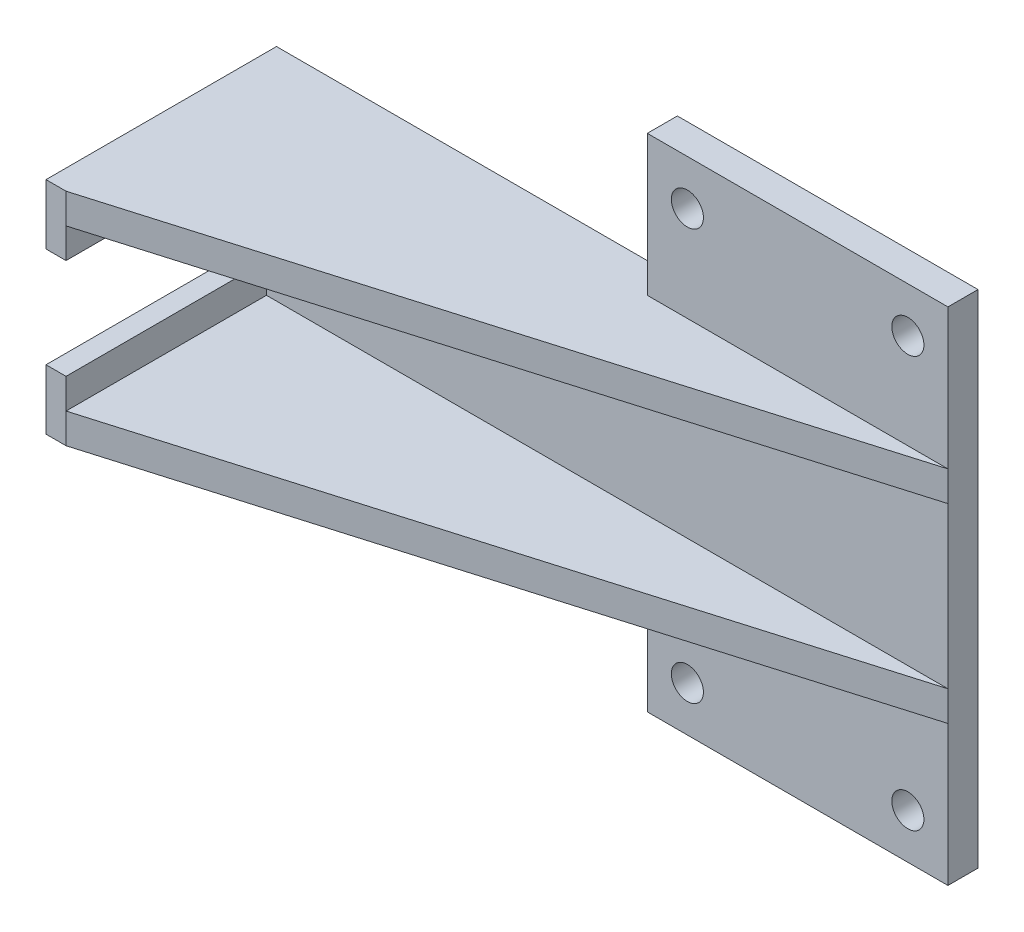
ISO-10303-21;
HEADER;
FILE_DESCRIPTION(('STEP AP214'),'2;1');
FILE_NAME('part.step','',(''),(''),'','','');
FILE_SCHEMA(('AUTOMOTIVE_DESIGN { 1 0 10303 214 1 1 1 1 }'));
ENDSEC;
DATA;
#1=APPLICATION_CONTEXT('core data for automotive mechanical design processes');
#2=APPLICATION_PROTOCOL_DEFINITION('international standard','automotive_design',2000,#1);
#3=PRODUCT_CONTEXT('',#1,'mechanical');
#4=PRODUCT('Part','Part','',(#3));
#5=PRODUCT_RELATED_PRODUCT_CATEGORY('part','',(#4));
#6=PRODUCT_DEFINITION_FORMATION('','',#4);
#7=PRODUCT_DEFINITION_CONTEXT('part definition',#1,'design');
#8=PRODUCT_DEFINITION('design','',#6,#7);
#9=PRODUCT_DEFINITION_SHAPE('','',#8);
#10=(LENGTH_UNIT() NAMED_UNIT(*) SI_UNIT(.MILLI.,.METRE.));
#11=(NAMED_UNIT(*) PLANE_ANGLE_UNIT() SI_UNIT($,.RADIAN.));
#12=(NAMED_UNIT(*) SI_UNIT($,.STERADIAN.) SOLID_ANGLE_UNIT());
#13=UNCERTAINTY_MEASURE_WITH_UNIT(LENGTH_MEASURE(1.E-05),#10,'distance_accuracy_value','');
#14=(GEOMETRIC_REPRESENTATION_CONTEXT(3) GLOBAL_UNCERTAINTY_ASSIGNED_CONTEXT((#13)) GLOBAL_UNIT_ASSIGNED_CONTEXT((#10,
#11,#12)) REPRESENTATION_CONTEXT('',''));
#15=CARTESIAN_POINT('',(0.,0.,0.));
#16=DIRECTION('',(0.,0.,1.));
#17=DIRECTION('',(1.,0.,0.));
#18=AXIS2_PLACEMENT_3D('',#15,#16,#17);
#19=CARTESIAN_POINT('',(0.,0.,3.));
#20=DIRECTION('',(0.,0.,-1.));
#21=DIRECTION('',(-1.,0.,0.));
#22=AXIS2_PLACEMENT_3D('',#19,#20,#21);
#23=PLANE('',#22);
#24=CARTESIAN_POINT('',(-14.,-35.5,3.));
#25=DIRECTION('',(0.,0.,1.));
#26=DIRECTION('',(1.,0.,0.));
#27=AXIS2_PLACEMENT_3D('',#24,#25,#26);
#28=CIRCLE('',#27,1.60000000000001);
#29=CARTESIAN_POINT('',(-12.4,-35.5,3.));
#30=VERTEX_POINT('',#29);
#31=EDGE_CURVE('E275',#30,#30,#28,.T.);
#32=ORIENTED_EDGE('',*,*,#31,.F.);
#33=EDGE_LOOP('',(#32));
#34=FACE_BOUND('',#33,.T.);
#35=CARTESIAN_POINT('',(-36.,-35.5,3.));
#36=DIRECTION('',(0.,0.,1.));
#37=DIRECTION('',(1.,0.,0.));
#38=AXIS2_PLACEMENT_3D('',#35,#36,#37);
#39=CIRCLE('',#38,1.60000000000002);
#40=CARTESIAN_POINT('',(-34.4,-35.5,3.));
#41=VERTEX_POINT('',#40);
#42=EDGE_CURVE('E263',#41,#41,#39,.T.);
#43=ORIENTED_EDGE('',*,*,#42,.F.);
#44=EDGE_LOOP('',(#43));
#45=FACE_BOUND('',#44,.T.);
#46=DIRECTION('',(-1.,0.,0.));
#47=VECTOR('',#46,1.);
#48=CARTESIAN_POINT('',(-40.,-26.,3.));
#49=LINE('',#48,#47);
#50=CARTESIAN_POINT('',(-10.,-26.,3.));
#51=VERTEX_POINT('',#50);
#52=CARTESIAN_POINT('',(-40.,-26.,3.));
#53=VERTEX_POINT('',#52);
#54=EDGE_CURVE('E188',#51,#53,#49,.T.);
#55=ORIENTED_EDGE('',*,*,#54,.T.);
#56=DIRECTION('',(0.,-1.,0.));
#57=VECTOR('',#56,1.);
#58=CARTESIAN_POINT('',(-40.,-23.,3.));
#59=LINE('',#58,#57);
#60=CARTESIAN_POINT('',(-40.,-40.,3.));
#61=VERTEX_POINT('',#60);
#62=EDGE_CURVE('E296',#53,#61,#59,.T.);
#63=ORIENTED_EDGE('',*,*,#62,.T.);
#64=DIRECTION('',(1.,0.,0.));
#65=VECTOR('',#64,1.);
#66=CARTESIAN_POINT('',(-10.,-40.,3.));
#67=LINE('',#66,#65);
#68=CARTESIAN_POINT('',(-10.,-40.,3.));
#69=VERTEX_POINT('',#68);
#70=EDGE_CURVE('E298',#61,#69,#67,.T.);
#71=ORIENTED_EDGE('',*,*,#70,.T.);
#72=DIRECTION('',(0.,1.,0.));
#73=VECTOR('',#72,1.);
#74=CARTESIAN_POINT('',(-10.,10.,3.));
#75=LINE('',#74,#73);
#76=EDGE_CURVE('E281',#69,#51,#75,.T.);
#77=ORIENTED_EDGE('',*,*,#76,.T.);
#78=EDGE_LOOP('',(#55,#63,#71,#77));
#79=FACE_BOUND('',#78,.T.);
#80=ADVANCED_FACE('F35',(#34,#45,#79),#23,.F.);
#81=CARTESIAN_POINT('',(-40.,-23.,3.));
#82=DIRECTION('',(1.,0.,0.));
#83=DIRECTION('',(0.,0.,-1.));
#84=AXIS2_PLACEMENT_3D('',#81,#82,#83);
#85=PLANE('',#84);
#86=DIRECTION('',(0.,0.,-1.));
#87=VECTOR('',#86,1.);
#88=CARTESIAN_POINT('',(-40.,-26.,0.));
#89=LINE('',#88,#87);
#90=CARTESIAN_POINT('',(-40.,-26.,0.));
#91=VERTEX_POINT('',#90);
#92=EDGE_CURVE('E183',#53,#91,#89,.T.);
#93=ORIENTED_EDGE('',*,*,#92,.T.);
#94=DIRECTION('',(0.,-1.,0.));
#95=VECTOR('',#94,1.);
#96=CARTESIAN_POINT('',(-40.,-23.,0.));
#97=LINE('',#96,#95);
#98=CARTESIAN_POINT('',(-40.,-40.,0.));
#99=VERTEX_POINT('',#98);
#100=EDGE_CURVE('E309',#91,#99,#97,.T.);
#101=ORIENTED_EDGE('',*,*,#100,.T.);
#102=DIRECTION('',(0.,0.,-1.));
#103=VECTOR('',#102,1.);
#104=CARTESIAN_POINT('',(-40.,-40.,3.));
#105=LINE('',#104,#103);
#106=EDGE_CURVE('E315',#61,#99,#105,.T.);
#107=ORIENTED_EDGE('',*,*,#106,.F.);
#108=ORIENTED_EDGE('',*,*,#62,.F.);
#109=EDGE_LOOP('',(#93,#101,#107,#108));
#110=FACE_BOUND('',#109,.T.);
#111=ADVANCED_FACE('F371',(#110),#85,.F.);
#112=CARTESIAN_POINT('',(-36.,5.5,3.));
#113=DIRECTION('',(0.,0.,1.));
#114=DIRECTION('',(1.,0.,0.));
#115=AXIS2_PLACEMENT_3D('',#112,#113,#114);
#116=CIRCLE('',#115,1.60000000000002);
#117=CARTESIAN_POINT('',(-34.4,5.5,3.));
#118=VERTEX_POINT('',#117);
#119=EDGE_CURVE('E269',#118,#118,#116,.T.);
#120=ORIENTED_EDGE('',*,*,#119,.F.);
#121=EDGE_LOOP('',(#120));
#122=FACE_BOUND('',#121,.T.);
#123=CARTESIAN_POINT('',(-14.,5.5,3.));
#124=DIRECTION('',(0.,0.,1.));
#125=DIRECTION('',(1.,0.,0.));
#126=AXIS2_PLACEMENT_3D('',#123,#124,#125);
#127=CIRCLE('',#126,1.60000000000001);
#128=CARTESIAN_POINT('',(-12.4,5.5,3.));
#129=VERTEX_POINT('',#128);
#130=EDGE_CURVE('E257',#129,#129,#127,.T.);
#131=ORIENTED_EDGE('',*,*,#130,.F.);
#132=EDGE_LOOP('',(#131));
#133=FACE_BOUND('',#132,.T.);
#134=DIRECTION('',(-1.,0.,0.));
#135=VECTOR('',#134,1.);
#136=CARTESIAN_POINT('',(-40.,-4.,3.));
#137=LINE('',#136,#135);
#138=CARTESIAN_POINT('',(-10.,-4.,3.));
#139=VERTEX_POINT('',#138);
#140=CARTESIAN_POINT('',(-40.,-4.,3.));
#141=VERTEX_POINT('',#140);
#142=EDGE_CURVE('E205',#139,#141,#137,.T.);
#143=ORIENTED_EDGE('',*,*,#142,.F.);
#144=CARTESIAN_POINT('',(-10.,10.,3.));
#145=VERTEX_POINT('',#144);
#146=EDGE_CURVE('E286',#139,#145,#75,.T.);
#147=ORIENTED_EDGE('',*,*,#146,.T.);
#148=DIRECTION('',(-1.,0.,0.));
#149=VECTOR('',#148,1.);
#150=CARTESIAN_POINT('',(-10.,10.,3.));
#151=LINE('',#150,#149);
#152=CARTESIAN_POINT('',(-40.,10.,3.));
#153=VERTEX_POINT('',#152);
#154=EDGE_CURVE('E284',#145,#153,#151,.T.);
#155=ORIENTED_EDGE('',*,*,#154,.T.);
#156=DIRECTION('',(0.,-1.,0.));
#157=VECTOR('',#156,1.);
#158=CARTESIAN_POINT('',(-40.,10.,3.));
#159=LINE('',#158,#157);
#160=EDGE_CURVE('E288',#153,#141,#159,.T.);
#161=ORIENTED_EDGE('',*,*,#160,.T.);
#162=EDGE_LOOP('',(#143,#147,#155,#161));
#163=FACE_BOUND('',#162,.T.);
#164=ADVANCED_FACE('F347',(#122,#133,#163),#23,.F.);
#165=CARTESIAN_POINT('',(-40.,10.,3.));
#166=DIRECTION('',(1.,0.,0.));
#167=DIRECTION('',(0.,0.,-1.));
#168=AXIS2_PLACEMENT_3D('',#165,#166,#167);
#169=PLANE('',#168);
#170=DIRECTION('',(0.,0.,-1.));
#171=VECTOR('',#170,1.);
#172=CARTESIAN_POINT('',(-40.,-4.,0.));
#173=LINE('',#172,#171);
#174=CARTESIAN_POINT('',(-40.,-4.,0.));
#175=VERTEX_POINT('',#174);
#176=EDGE_CURVE('E207',#141,#175,#173,.T.);
#177=ORIENTED_EDGE('',*,*,#176,.F.);
#178=ORIENTED_EDGE('',*,*,#160,.F.);
#179=DIRECTION('',(0.,0.,-1.));
#180=VECTOR('',#179,1.);
#181=CARTESIAN_POINT('',(-40.,10.,3.));
#182=LINE('',#181,#180);
#183=CARTESIAN_POINT('',(-40.,10.,0.));
#184=VERTEX_POINT('',#183);
#185=EDGE_CURVE('E43',#153,#184,#182,.T.);
#186=ORIENTED_EDGE('',*,*,#185,.T.);
#187=DIRECTION('',(0.,-1.,0.));
#188=VECTOR('',#187,1.);
#189=CARTESIAN_POINT('',(-40.,10.,0.));
#190=LINE('',#189,#188);
#191=EDGE_CURVE('E305',#184,#175,#190,.T.);
#192=ORIENTED_EDGE('',*,*,#191,.T.);
#193=EDGE_LOOP('',(#177,#178,#186,#192));
#194=FACE_BOUND('',#193,.T.);
#195=ADVANCED_FACE('F323',(#194),#169,.F.);
#196=DIRECTION('',(1.,0.,0.));
#197=VECTOR('',#196,1.);
#198=CARTESIAN_POINT('',(-80.,-23.,3.));
#199=LINE('',#198,#197);
#200=CARTESIAN_POINT('',(-78.,-23.,3.));
#201=VERTEX_POINT('',#200);
#202=CARTESIAN_POINT('',(-10.,-23.,3.));
#203=VERTEX_POINT('',#202);
#204=EDGE_CURVE('E294',#201,#203,#199,.T.);
#205=ORIENTED_EDGE('',*,*,#204,.T.);
#206=CARTESIAN_POINT('',(-10.,-7.,3.));
#207=VERTEX_POINT('',#206);
#208=EDGE_CURVE('E285',#203,#207,#75,.T.);
#209=ORIENTED_EDGE('',*,*,#208,.T.);
#210=DIRECTION('',(-1.,0.,0.));
#211=VECTOR('',#210,1.);
#212=CARTESIAN_POINT('',(-80.,-7.,3.));
#213=LINE('',#212,#211);
#214=CARTESIAN_POINT('',(-78.,-7.,3.));
#215=VERTEX_POINT('',#214);
#216=EDGE_CURVE('E291',#207,#215,#213,.T.);
#217=ORIENTED_EDGE('',*,*,#216,.T.);
#218=DIRECTION('',(0.,1.,0.));
#219=VECTOR('',#218,1.);
#220=CARTESIAN_POINT('',(-78.,-7.,3.));
#221=LINE('',#220,#219);
#222=CARTESIAN_POINT('',(-78.,-10.,3.));
#223=VERTEX_POINT('',#222);
#224=EDGE_CURVE('E50',#223,#215,#221,.T.);
#225=ORIENTED_EDGE('',*,*,#224,.F.);
#226=DIRECTION('',(1.,0.,0.));
#227=VECTOR('',#226,1.);
#228=CARTESIAN_POINT('',(-80.,-10.,3.));
#229=LINE('',#228,#227);
#230=CARTESIAN_POINT('',(-80.,-10.,3.));
#231=VERTEX_POINT('',#230);
#232=EDGE_CURVE('E223',#231,#223,#229,.T.);
#233=ORIENTED_EDGE('',*,*,#232,.F.);
#234=DIRECTION('',(0.,-1.,0.));
#235=VECTOR('',#234,1.);
#236=CARTESIAN_POINT('',(-80.,-23.,3.));
#237=LINE('',#236,#235);
#238=CARTESIAN_POINT('',(-80.,-20.,3.));
#239=VERTEX_POINT('',#238);
#240=EDGE_CURVE('E56',#231,#239,#237,.T.);
#241=ORIENTED_EDGE('',*,*,#240,.T.);
#242=DIRECTION('',(-1.,0.,0.));
#243=VECTOR('',#242,1.);
#244=CARTESIAN_POINT('',(-80.,-20.,3.));
#245=LINE('',#244,#243);
#246=CARTESIAN_POINT('',(-78.,-20.,3.));
#247=VERTEX_POINT('',#246);
#248=EDGE_CURVE('E167',#247,#239,#245,.T.);
#249=ORIENTED_EDGE('',*,*,#248,.F.);
#250=DIRECTION('',(0.,1.,0.));
#251=VECTOR('',#250,1.);
#252=CARTESIAN_POINT('',(-78.,-23.,3.));
#253=LINE('',#252,#251);
#254=EDGE_CURVE('E241',#201,#247,#253,.T.);
#255=ORIENTED_EDGE('',*,*,#254,.F.);
#256=EDGE_LOOP('',(#205,#209,#217,#225,#233,#241,#249,#255));
#257=FACE_BOUND('',#256,.T.);
#258=ADVANCED_FACE('F350',(#257),#23,.F.);
#259=CARTESIAN_POINT('',(0.,0.,0.));
#260=DIRECTION('',(0.,0.,-1.));
#261=DIRECTION('',(-1.,0.,0.));
#262=AXIS2_PLACEMENT_3D('',#259,#260,#261);
#263=PLANE('',#262);
#264=CARTESIAN_POINT('',(-36.,-35.5,0.));
#265=DIRECTION('',(0.,0.,1.));
#266=DIRECTION('',(1.,0.,0.));
#267=AXIS2_PLACEMENT_3D('',#264,#265,#266);
#268=CIRCLE('',#267,1.60000000000002);
#269=CARTESIAN_POINT('',(-34.4,-35.5,0.));
#270=VERTEX_POINT('',#269);
#271=EDGE_CURVE('E260',#270,#270,#268,.T.);
#272=ORIENTED_EDGE('',*,*,#271,.T.);
#273=EDGE_LOOP('',(#272));
#274=FACE_BOUND('',#273,.T.);
#275=CARTESIAN_POINT('',(-14.,-35.5,0.));
#276=DIRECTION('',(0.,0.,1.));
#277=DIRECTION('',(1.,0.,0.));
#278=AXIS2_PLACEMENT_3D('',#275,#276,#277);
#279=CIRCLE('',#278,1.60000000000001);
#280=CARTESIAN_POINT('',(-12.4,-35.5,0.));
#281=VERTEX_POINT('',#280);
#282=EDGE_CURVE('E272',#281,#281,#279,.T.);
#283=ORIENTED_EDGE('',*,*,#282,.T.);
#284=EDGE_LOOP('',(#283));
#285=FACE_BOUND('',#284,.T.);
#286=DIRECTION('',(0.,1.,0.));
#287=VECTOR('',#286,1.);
#288=CARTESIAN_POINT('',(-10.,10.,0.));
#289=LINE('',#288,#287);
#290=CARTESIAN_POINT('',(-10.,-40.,0.));
#291=VERTEX_POINT('',#290);
#292=CARTESIAN_POINT('',(-10.,10.,0.));
#293=VERTEX_POINT('',#292);
#294=EDGE_CURVE('E278',#291,#293,#289,.T.);
#295=ORIENTED_EDGE('',*,*,#294,.F.);
#296=DIRECTION('',(1.,0.,0.));
#297=VECTOR('',#296,1.);
#298=CARTESIAN_POINT('',(-10.,-40.,0.));
#299=LINE('',#298,#297);
#300=EDGE_CURVE('E311',#99,#291,#299,.T.);
#301=ORIENTED_EDGE('',*,*,#300,.F.);
#302=ORIENTED_EDGE('',*,*,#100,.F.);
#303=DIRECTION('',(-1.,0.,0.));
#304=VECTOR('',#303,1.);
#305=CARTESIAN_POINT('',(-80.,-26.,0.));
#306=LINE('',#305,#304);
#307=CARTESIAN_POINT('',(-80.,-26.,0.));
#308=VERTEX_POINT('',#307);
#309=EDGE_CURVE('E181',#91,#308,#306,.T.);
#310=ORIENTED_EDGE('',*,*,#309,.T.);
#311=DIRECTION('',(0.,-1.,0.));
#312=VECTOR('',#311,1.);
#313=CARTESIAN_POINT('',(-80.,-23.,0.));
#314=LINE('',#313,#312);
#315=CARTESIAN_POINT('',(-80.,-4.,0.));
#316=VERTEX_POINT('',#315);
#317=EDGE_CURVE('E180',#316,#308,#314,.T.);
#318=ORIENTED_EDGE('',*,*,#317,.F.);
#319=DIRECTION('',(-1.,0.,0.));
#320=VECTOR('',#319,1.);
#321=CARTESIAN_POINT('',(-80.,-4.,0.));
#322=LINE('',#321,#320);
#323=EDGE_CURVE('E209',#175,#316,#322,.T.);
#324=ORIENTED_EDGE('',*,*,#323,.F.);
#325=ORIENTED_EDGE('',*,*,#191,.F.);
#326=DIRECTION('',(-1.,0.,0.));
#327=VECTOR('',#326,1.);
#328=CARTESIAN_POINT('',(-10.,10.,0.));
#329=LINE('',#328,#327);
#330=EDGE_CURVE('E303',#293,#184,#329,.T.);
#331=ORIENTED_EDGE('',*,*,#330,.F.);
#332=EDGE_LOOP('',(#295,#301,#302,#310,#318,#324,#325,#331));
#333=FACE_BOUND('',#332,.T.);
#334=CARTESIAN_POINT('',(-36.,5.5,0.));
#335=DIRECTION('',(0.,0.,1.));
#336=DIRECTION('',(1.,0.,0.));
#337=AXIS2_PLACEMENT_3D('',#334,#335,#336);
#338=CIRCLE('',#337,1.60000000000002);
#339=CARTESIAN_POINT('',(-34.4,5.5,0.));
#340=VERTEX_POINT('',#339);
#341=EDGE_CURVE('E266',#340,#340,#338,.T.);
#342=ORIENTED_EDGE('',*,*,#341,.T.);
#343=EDGE_LOOP('',(#342));
#344=FACE_BOUND('',#343,.T.);
#345=CARTESIAN_POINT('',(-14.,5.5,0.));
#346=DIRECTION('',(0.,0.,1.));
#347=DIRECTION('',(1.,0.,0.));
#348=AXIS2_PLACEMENT_3D('',#345,#346,#347);
#349=CIRCLE('',#348,1.60000000000001);
#350=CARTESIAN_POINT('',(-12.4,5.5,0.));
#351=VERTEX_POINT('',#350);
#352=EDGE_CURVE('E256',#351,#351,#349,.T.);
#353=ORIENTED_EDGE('',*,*,#352,.T.);
#354=EDGE_LOOP('',(#353));
#355=FACE_BOUND('',#354,.T.);
#356=ADVANCED_FACE('F329',(#274,#285,#333,#344,#355),#263,.T.);
#357=CARTESIAN_POINT('',(-10.,10.,3.));
#358=DIRECTION('',(-1.,0.,0.));
#359=DIRECTION('',(0.,0.,1.));
#360=AXIS2_PLACEMENT_3D('',#357,#358,#359);
#361=PLANE('',#360);
#362=ORIENTED_EDGE('',*,*,#294,.T.);
#363=DIRECTION('',(0.,0.,-1.));
#364=VECTOR('',#363,1.);
#365=CARTESIAN_POINT('',(-10.,10.,3.));
#366=LINE('',#365,#364);
#367=EDGE_CURVE('E11',#145,#293,#366,.T.);
#368=ORIENTED_EDGE('',*,*,#367,.F.);
#369=ORIENTED_EDGE('',*,*,#146,.F.);
#370=DIRECTION('',(0.,-1.,0.));
#371=VECTOR('',#370,1.);
#372=CARTESIAN_POINT('',(-10.,-4.,3.));
#373=LINE('',#372,#371);
#374=EDGE_CURVE('E215',#139,#207,#373,.T.);
#375=ORIENTED_EDGE('',*,*,#374,.T.);
#376=ORIENTED_EDGE('',*,*,#208,.F.);
#377=DIRECTION('',(0.,1.,0.));
#378=VECTOR('',#377,1.);
#379=CARTESIAN_POINT('',(-10.,-26.,3.));
#380=LINE('',#379,#378);
#381=EDGE_CURVE('E196',#51,#203,#380,.T.);
#382=ORIENTED_EDGE('',*,*,#381,.F.);
#383=ORIENTED_EDGE('',*,*,#76,.F.);
#384=DIRECTION('',(0.,0.,-1.));
#385=VECTOR('',#384,1.);
#386=CARTESIAN_POINT('',(-10.,-40.,3.));
#387=LINE('',#386,#385);
#388=EDGE_CURVE('E300',#69,#291,#387,.T.);
#389=ORIENTED_EDGE('',*,*,#388,.T.);
#390=EDGE_LOOP('',(#362,#368,#369,#375,#376,#382,#383,#389));
#391=FACE_BOUND('',#390,.T.);
#392=ADVANCED_FACE('F37',(#391),#361,.F.);
#393=CARTESIAN_POINT('',(-10.,10.,3.));
#394=DIRECTION('',(0.,-1.,0.));
#395=DIRECTION('',(0.,0.,-1.));
#396=AXIS2_PLACEMENT_3D('',#393,#394,#395);
#397=PLANE('',#396);
#398=ORIENTED_EDGE('',*,*,#330,.T.);
#399=ORIENTED_EDGE('',*,*,#185,.F.);
#400=ORIENTED_EDGE('',*,*,#154,.F.);
#401=ORIENTED_EDGE('',*,*,#367,.T.);
#402=EDGE_LOOP('',(#398,#399,#400,#401));
#403=FACE_BOUND('',#402,.T.);
#404=ADVANCED_FACE('F395',(#403),#397,.F.);
#405=CARTESIAN_POINT('',(-80.,-23.,3.));
#406=DIRECTION('',(1.,0.,0.));
#407=DIRECTION('',(0.,0.,-1.));
#408=AXIS2_PLACEMENT_3D('',#405,#406,#407);
#409=PLANE('',#408);
#410=ORIENTED_EDGE('',*,*,#317,.T.);
#411=DIRECTION('',(0.,0.,1.));
#412=VECTOR('',#411,1.);
#413=CARTESIAN_POINT('',(-80.,-26.,23.));
#414=LINE('',#413,#412);
#415=CARTESIAN_POINT('',(-80.,-26.,23.));
#416=VERTEX_POINT('',#415);
#417=EDGE_CURVE('E172',#308,#416,#414,.T.);
#418=ORIENTED_EDGE('',*,*,#417,.T.);
#419=DIRECTION('',(0.,-1.,0.));
#420=VECTOR('',#419,1.);
#421=CARTESIAN_POINT('',(-80.,-23.,23.));
#422=LINE('',#421,#420);
#423=CARTESIAN_POINT('',(-80.,-20.,23.));
#424=VERTEX_POINT('',#423);
#425=EDGE_CURVE('E154',#424,#416,#422,.T.);
#426=ORIENTED_EDGE('',*,*,#425,.F.);
#427=DIRECTION('',(0.,0.,-1.));
#428=VECTOR('',#427,1.);
#429=CARTESIAN_POINT('',(-80.,-20.,23.));
#430=LINE('',#429,#428);
#431=EDGE_CURVE('E245',#424,#239,#430,.T.);
#432=ORIENTED_EDGE('',*,*,#431,.T.);
#433=ORIENTED_EDGE('',*,*,#240,.F.);
#434=DIRECTION('',(0.,0.,-1.));
#435=VECTOR('',#434,1.);
#436=CARTESIAN_POINT('',(-80.,-10.,23.));
#437=LINE('',#436,#435);
#438=CARTESIAN_POINT('',(-80.,-10.,23.));
#439=VERTEX_POINT('',#438);
#440=EDGE_CURVE('E239',#439,#231,#437,.T.);
#441=ORIENTED_EDGE('',*,*,#440,.F.);
#442=DIRECTION('',(0.,-1.,0.));
#443=VECTOR('',#442,1.);
#444=CARTESIAN_POINT('',(-80.,-7.,23.));
#445=LINE('',#444,#443);
#446=CARTESIAN_POINT('',(-80.,-4.,23.));
#447=VERTEX_POINT('',#446);
#448=EDGE_CURVE('E224',#447,#439,#445,.T.);
#449=ORIENTED_EDGE('',*,*,#448,.F.);
#450=DIRECTION('',(0.,0.,1.));
#451=VECTOR('',#450,1.);
#452=CARTESIAN_POINT('',(-80.,-4.,23.));
#453=LINE('',#452,#451);
#454=EDGE_CURVE('E212',#316,#447,#453,.T.);
#455=ORIENTED_EDGE('',*,*,#454,.F.);
#456=EDGE_LOOP('',(#410,#418,#426,#432,#433,#441,#449,#455));
#457=FACE_BOUND('',#456,.T.);
#458=ADVANCED_FACE('F178',(#457),#409,.F.);
#459=CARTESIAN_POINT('',(-10.,-40.,3.));
#460=DIRECTION('',(0.,1.,0.));
#461=DIRECTION('',(0.,0.,1.));
#462=AXIS2_PLACEMENT_3D('',#459,#460,#461);
#463=PLANE('',#462);
#464=ORIENTED_EDGE('',*,*,#300,.T.);
#465=ORIENTED_EDGE('',*,*,#388,.F.);
#466=ORIENTED_EDGE('',*,*,#70,.F.);
#467=ORIENTED_EDGE('',*,*,#106,.T.);
#468=EDGE_LOOP('',(#464,#465,#466,#467));
#469=FACE_BOUND('',#468,.T.);
#470=ADVANCED_FACE('F401',(#469),#463,.F.);
#471=CARTESIAN_POINT('',(-14.,-35.5,3.));
#472=DIRECTION('',(0.,0.,-1.));
#473=DIRECTION('',(-1.,0.,0.));
#474=AXIS2_PLACEMENT_3D('',#471,#472,#473);
#475=CYLINDRICAL_SURFACE('',#474,1.60000000000001);
#476=ORIENTED_EDGE('',*,*,#31,.T.);
#477=EDGE_LOOP('',(#476));
#478=FACE_BOUND('',#477,.T.);
#479=ORIENTED_EDGE('',*,*,#282,.F.);
#480=EDGE_LOOP('',(#479));
#481=FACE_BOUND('',#480,.T.);
#482=ADVANCED_FACE('F438',(#478,#481),#475,.F.);
#483=CARTESIAN_POINT('',(-36.,5.5,3.));
#484=DIRECTION('',(0.,0.,-1.));
#485=DIRECTION('',(-1.,0.,0.));
#486=AXIS2_PLACEMENT_3D('',#483,#484,#485);
#487=CYLINDRICAL_SURFACE('',#486,1.60000000000002);
#488=ORIENTED_EDGE('',*,*,#119,.T.);
#489=EDGE_LOOP('',(#488));
#490=FACE_BOUND('',#489,.T.);
#491=ORIENTED_EDGE('',*,*,#341,.F.);
#492=EDGE_LOOP('',(#491));
#493=FACE_BOUND('',#492,.T.);
#494=ADVANCED_FACE('F435',(#490,#493),#487,.F.);
#495=CARTESIAN_POINT('',(-36.,-35.5,3.));
#496=DIRECTION('',(0.,0.,-1.));
#497=DIRECTION('',(-1.,0.,0.));
#498=AXIS2_PLACEMENT_3D('',#495,#496,#497);
#499=CYLINDRICAL_SURFACE('',#498,1.60000000000002);
#500=ORIENTED_EDGE('',*,*,#42,.T.);
#501=EDGE_LOOP('',(#500));
#502=FACE_BOUND('',#501,.T.);
#503=ORIENTED_EDGE('',*,*,#271,.F.);
#504=EDGE_LOOP('',(#503));
#505=FACE_BOUND('',#504,.T.);
#506=ADVANCED_FACE('F431',(#502,#505),#499,.F.);
#507=CARTESIAN_POINT('',(-14.,5.5,3.));
#508=DIRECTION('',(0.,0.,-1.));
#509=DIRECTION('',(-1.,0.,0.));
#510=AXIS2_PLACEMENT_3D('',#507,#508,#509);
#511=CYLINDRICAL_SURFACE('',#510,1.60000000000001);
#512=ORIENTED_EDGE('',*,*,#130,.T.);
#513=EDGE_LOOP('',(#512));
#514=FACE_BOUND('',#513,.T.);
#515=ORIENTED_EDGE('',*,*,#352,.F.);
#516=EDGE_LOOP('',(#515));
#517=FACE_BOUND('',#516,.T.);
#518=ADVANCED_FACE('F426',(#514,#517),#511,.F.);
#519=CARTESIAN_POINT('',(-78.,-23.,23.));
#520=DIRECTION('',(-1.,0.,0.));
#521=DIRECTION('',(0.,0.,1.));
#522=AXIS2_PLACEMENT_3D('',#519,#520,#521);
#523=PLANE('',#522);
#524=ORIENTED_EDGE('',*,*,#254,.T.);
#525=DIRECTION('',(0.,0.,-1.));
#526=VECTOR('',#525,1.);
#527=CARTESIAN_POINT('',(-78.,-20.,23.));
#528=LINE('',#527,#526);
#529=CARTESIAN_POINT('',(-78.,-20.,23.));
#530=VERTEX_POINT('',#529);
#531=EDGE_CURVE('E250',#530,#247,#528,.T.);
#532=ORIENTED_EDGE('',*,*,#531,.F.);
#533=DIRECTION('',(0.,1.,0.));
#534=VECTOR('',#533,1.);
#535=CARTESIAN_POINT('',(-78.,-23.,23.));
#536=LINE('',#535,#534);
#537=CARTESIAN_POINT('',(-78.,-23.,23.));
#538=VERTEX_POINT('',#537);
#539=EDGE_CURVE('E166',#538,#530,#536,.T.);
#540=ORIENTED_EDGE('',*,*,#539,.F.);
#541=DIRECTION('',(0.,0.,-1.));
#542=VECTOR('',#541,1.);
#543=CARTESIAN_POINT('',(-78.,-23.,23.));
#544=LINE('',#543,#542);
#545=EDGE_CURVE('E253',#538,#201,#544,.T.);
#546=ORIENTED_EDGE('',*,*,#545,.T.);
#547=EDGE_LOOP('',(#524,#532,#540,#546));
#548=FACE_BOUND('',#547,.T.);
#549=ADVANCED_FACE('F419',(#548),#523,.F.);
#550=CARTESIAN_POINT('',(-80.,-20.,23.));
#551=DIRECTION('',(0.,-1.,0.));
#552=DIRECTION('',(0.,0.,-1.));
#553=AXIS2_PLACEMENT_3D('',#550,#551,#552);
#554=PLANE('',#553);
#555=ORIENTED_EDGE('',*,*,#248,.T.);
#556=ORIENTED_EDGE('',*,*,#431,.F.);
#557=DIRECTION('',(-1.,0.,0.));
#558=VECTOR('',#557,1.);
#559=CARTESIAN_POINT('',(-80.,-20.,23.));
#560=LINE('',#559,#558);
#561=EDGE_CURVE('E161',#530,#424,#560,.T.);
#562=ORIENTED_EDGE('',*,*,#561,.F.);
#563=ORIENTED_EDGE('',*,*,#531,.T.);
#564=EDGE_LOOP('',(#555,#556,#562,#563));
#565=FACE_BOUND('',#564,.T.);
#566=ADVANCED_FACE('F368',(#565),#554,.F.);
#567=CARTESIAN_POINT('',(0.,0.,23.));
#568=DIRECTION('',(0.,0.,-1.));
#569=DIRECTION('',(-1.,0.,0.));
#570=AXIS2_PLACEMENT_3D('',#567,#568,#569);
#571=PLANE('',#570);
#572=ORIENTED_EDGE('',*,*,#425,.T.);
#573=DIRECTION('',(1.,0.,0.));
#574=VECTOR('',#573,1.);
#575=CARTESIAN_POINT('',(-78.,-26.,23.));
#576=LINE('',#575,#574);
#577=CARTESIAN_POINT('',(-78.,-26.,23.));
#578=VERTEX_POINT('',#577);
#579=EDGE_CURVE('E158',#416,#578,#576,.T.);
#580=ORIENTED_EDGE('',*,*,#579,.T.);
#581=DIRECTION('',(0.,1.,0.));
#582=VECTOR('',#581,1.);
#583=CARTESIAN_POINT('',(-78.,-26.,23.));
#584=LINE('',#583,#582);
#585=EDGE_CURVE('E192',#578,#538,#584,.T.);
#586=ORIENTED_EDGE('',*,*,#585,.T.);
#587=ORIENTED_EDGE('',*,*,#539,.T.);
#588=ORIENTED_EDGE('',*,*,#561,.T.);
#589=EDGE_LOOP('',(#572,#580,#586,#587,#588));
#590=FACE_BOUND('',#589,.T.);
#591=ADVANCED_FACE('F156',(#590),#571,.F.);
#592=CARTESIAN_POINT('',(-80.,-10.,23.));
#593=DIRECTION('',(0.,1.,0.));
#594=DIRECTION('',(0.,0.,1.));
#595=AXIS2_PLACEMENT_3D('',#592,#593,#594);
#596=PLANE('',#595);
#597=ORIENTED_EDGE('',*,*,#232,.T.);
#598=DIRECTION('',(0.,0.,-1.));
#599=VECTOR('',#598,1.);
#600=CARTESIAN_POINT('',(-78.,-10.,23.));
#601=LINE('',#600,#599);
#602=CARTESIAN_POINT('',(-78.,-10.,23.));
#603=VERTEX_POINT('',#602);
#604=EDGE_CURVE('E236',#603,#223,#601,.T.);
#605=ORIENTED_EDGE('',*,*,#604,.F.);
#606=DIRECTION('',(1.,0.,0.));
#607=VECTOR('',#606,1.);
#608=CARTESIAN_POINT('',(-80.,-10.,23.));
#609=LINE('',#608,#607);
#610=EDGE_CURVE('E227',#439,#603,#609,.T.);
#611=ORIENTED_EDGE('',*,*,#610,.F.);
#612=ORIENTED_EDGE('',*,*,#440,.T.);
#613=EDGE_LOOP('',(#597,#605,#611,#612));
#614=FACE_BOUND('',#613,.T.);
#615=ADVANCED_FACE('F360',(#614),#596,.F.);
#616=CARTESIAN_POINT('',(-78.,-7.,23.));
#617=DIRECTION('',(-1.,0.,0.));
#618=DIRECTION('',(0.,0.,1.));
#619=AXIS2_PLACEMENT_3D('',#616,#617,#618);
#620=PLANE('',#619);
#621=ORIENTED_EDGE('',*,*,#224,.T.);
#622=DIRECTION('',(0.,0.,-1.));
#623=VECTOR('',#622,1.);
#624=CARTESIAN_POINT('',(-78.,-7.,23.));
#625=LINE('',#624,#623);
#626=CARTESIAN_POINT('',(-78.,-7.,23.));
#627=VERTEX_POINT('',#626);
#628=EDGE_CURVE('E232',#627,#215,#625,.T.);
#629=ORIENTED_EDGE('',*,*,#628,.F.);
#630=DIRECTION('',(0.,1.,0.));
#631=VECTOR('',#630,1.);
#632=CARTESIAN_POINT('',(-78.,-7.,23.));
#633=LINE('',#632,#631);
#634=EDGE_CURVE('E229',#603,#627,#633,.T.);
#635=ORIENTED_EDGE('',*,*,#634,.F.);
#636=ORIENTED_EDGE('',*,*,#604,.T.);
#637=EDGE_LOOP('',(#621,#629,#635,#636));
#638=FACE_BOUND('',#637,.T.);
#639=ADVANCED_FACE('F358',(#638),#620,.F.);
#640=CARTESIAN_POINT('',(0.,0.,23.));
#641=DIRECTION('',(0.,0.,1.));
#642=DIRECTION('',(1.,0.,0.));
#643=AXIS2_PLACEMENT_3D('',#640,#641,#642);
#644=PLANE('',#643);
#645=ORIENTED_EDGE('',*,*,#448,.T.);
#646=ORIENTED_EDGE('',*,*,#610,.T.);
#647=ORIENTED_EDGE('',*,*,#634,.T.);
#648=DIRECTION('',(0.,-1.,0.));
#649=VECTOR('',#648,1.);
#650=CARTESIAN_POINT('',(-78.,-4.,23.));
#651=LINE('',#650,#649);
#652=CARTESIAN_POINT('',(-78.,-4.,23.));
#653=VERTEX_POINT('',#652);
#654=EDGE_CURVE('E220',#653,#627,#651,.T.);
#655=ORIENTED_EDGE('',*,*,#654,.F.);
#656=DIRECTION('',(1.,0.,0.));
#657=VECTOR('',#656,1.);
#658=CARTESIAN_POINT('',(-78.,-4.,23.));
#659=LINE('',#658,#657);
#660=EDGE_CURVE('E200',#447,#653,#659,.T.);
#661=ORIENTED_EDGE('',*,*,#660,.F.);
#662=EDGE_LOOP('',(#645,#646,#647,#655,#661));
#663=FACE_BOUND('',#662,.T.);
#664=ADVANCED_FACE('F336',(#663),#644,.T.);
#665=CARTESIAN_POINT('',(0.,-7.,0.));
#666=DIRECTION('',(0.,-1.,0.));
#667=DIRECTION('',(0.,0.,-1.));
#668=AXIS2_PLACEMENT_3D('',#665,#666,#667);
#669=PLANE('',#668);
#670=ORIENTED_EDGE('',*,*,#216,.F.);
#671=DIRECTION('',(0.959365501571271,0.,-0.28216632399155));
#672=VECTOR('',#671,1.);
#673=CARTESIAN_POINT('',(-78.,-7.,23.));
#674=LINE('',#673,#672);
#675=EDGE_CURVE('E199',#627,#207,#674,.T.);
#676=ORIENTED_EDGE('',*,*,#675,.F.);
#677=ORIENTED_EDGE('',*,*,#628,.T.);
#678=EDGE_LOOP('',(#670,#676,#677));
#679=FACE_BOUND('',#678,.T.);
#680=ADVANCED_FACE('F354',(#679),#669,.T.);
#681=CARTESIAN_POINT('',(-78.,-4.,23.));
#682=DIRECTION('',(-0.28216632399155,0.,-0.95936550157127));
#683=DIRECTION('',(-0.959365501571271,0.,0.28216632399155));
#684=AXIS2_PLACEMENT_3D('',#681,#682,#683);
#685=PLANE('',#684);
#686=ORIENTED_EDGE('',*,*,#675,.T.);
#687=ORIENTED_EDGE('',*,*,#374,.F.);
#688=DIRECTION('',(0.959365501571271,0.,-0.28216632399155));
#689=VECTOR('',#688,1.);
#690=CARTESIAN_POINT('',(-78.,-4.,23.));
#691=LINE('',#690,#689);
#692=EDGE_CURVE('E203',#653,#139,#691,.T.);
#693=ORIENTED_EDGE('',*,*,#692,.F.);
#694=ORIENTED_EDGE('',*,*,#654,.T.);
#695=EDGE_LOOP('',(#686,#687,#693,#694));
#696=FACE_BOUND('',#695,.T.);
#697=ADVANCED_FACE('F342',(#696),#685,.F.);
#698=CARTESIAN_POINT('',(0.,-4.,0.));
#699=DIRECTION('',(0.,-1.,0.));
#700=DIRECTION('',(0.,0.,-1.));
#701=AXIS2_PLACEMENT_3D('',#698,#699,#700);
#702=PLANE('',#701);
#703=ORIENTED_EDGE('',*,*,#660,.T.);
#704=ORIENTED_EDGE('',*,*,#692,.T.);
#705=ORIENTED_EDGE('',*,*,#142,.T.);
#706=ORIENTED_EDGE('',*,*,#176,.T.);
#707=ORIENTED_EDGE('',*,*,#323,.T.);
#708=ORIENTED_EDGE('',*,*,#454,.T.);
#709=EDGE_LOOP('',(#703,#704,#705,#706,#707,#708));
#710=FACE_BOUND('',#709,.T.);
#711=ADVANCED_FACE('F332',(#710),#702,.F.);
#712=CARTESIAN_POINT('',(0.,-23.,0.));
#713=DIRECTION('',(0.,1.,0.));
#714=DIRECTION('',(0.,0.,-1.));
#715=AXIS2_PLACEMENT_3D('',#712,#713,#714);
#716=PLANE('',#715);
#717=ORIENTED_EDGE('',*,*,#204,.F.);
#718=ORIENTED_EDGE('',*,*,#545,.F.);
#719=DIRECTION('',(0.959365501571271,0.,-0.28216632399155));
#720=VECTOR('',#719,1.);
#721=CARTESIAN_POINT('',(-78.,-23.,23.));
#722=LINE('',#721,#720);
#723=EDGE_CURVE('E176',#538,#203,#722,.T.);
#724=ORIENTED_EDGE('',*,*,#723,.T.);
#725=EDGE_LOOP('',(#717,#718,#724));
#726=FACE_BOUND('',#725,.T.);
#727=ADVANCED_FACE('F415',(#726),#716,.T.);
#728=CARTESIAN_POINT('',(-78.,-26.,23.));
#729=DIRECTION('',(0.28216632399155,0.,0.95936550157127));
#730=DIRECTION('',(0.959365501571271,0.,-0.28216632399155));
#731=AXIS2_PLACEMENT_3D('',#728,#729,#730);
#732=PLANE('',#731);
#733=ORIENTED_EDGE('',*,*,#723,.F.);
#734=ORIENTED_EDGE('',*,*,#585,.F.);
#735=DIRECTION('',(0.959365501571271,0.,-0.28216632399155));
#736=VECTOR('',#735,1.);
#737=CARTESIAN_POINT('',(-78.,-26.,23.));
#738=LINE('',#737,#736);
#739=EDGE_CURVE('E175',#578,#51,#738,.T.);
#740=ORIENTED_EDGE('',*,*,#739,.T.);
#741=ORIENTED_EDGE('',*,*,#381,.T.);
#742=EDGE_LOOP('',(#733,#734,#740,#741));
#743=FACE_BOUND('',#742,.T.);
#744=ADVANCED_FACE('F412',(#743),#732,.T.);
#745=CARTESIAN_POINT('',(0.,-26.,0.));
#746=DIRECTION('',(0.,1.,0.));
#747=DIRECTION('',(0.,0.,-1.));
#748=AXIS2_PLACEMENT_3D('',#745,#746,#747);
#749=PLANE('',#748);
#750=ORIENTED_EDGE('',*,*,#579,.F.);
#751=ORIENTED_EDGE('',*,*,#417,.F.);
#752=ORIENTED_EDGE('',*,*,#309,.F.);
#753=ORIENTED_EDGE('',*,*,#92,.F.);
#754=ORIENTED_EDGE('',*,*,#54,.F.);
#755=ORIENTED_EDGE('',*,*,#739,.F.);
#756=EDGE_LOOP('',(#750,#751,#752,#753,#754,#755));
#757=FACE_BOUND('',#756,.T.);
#758=ADVANCED_FACE('F171',(#757),#749,.F.);
#759=CLOSED_SHELL('',(#80,#111,#164,#195,#258,#356,#392,#404,#458,#470,#482,#494,#506,#518,#549,
#566,#591,#615,#639,#664,#680,#697,#711,#727,#744,#758));
#760=MANIFOLD_SOLID_BREP('B2',#759);
#761=ADVANCED_BREP_SHAPE_REPRESENTATION('',(#18,#760),#14);
#762=SHAPE_DEFINITION_REPRESENTATION(#9,#761);
ENDSEC;
END-ISO-10303-21;
